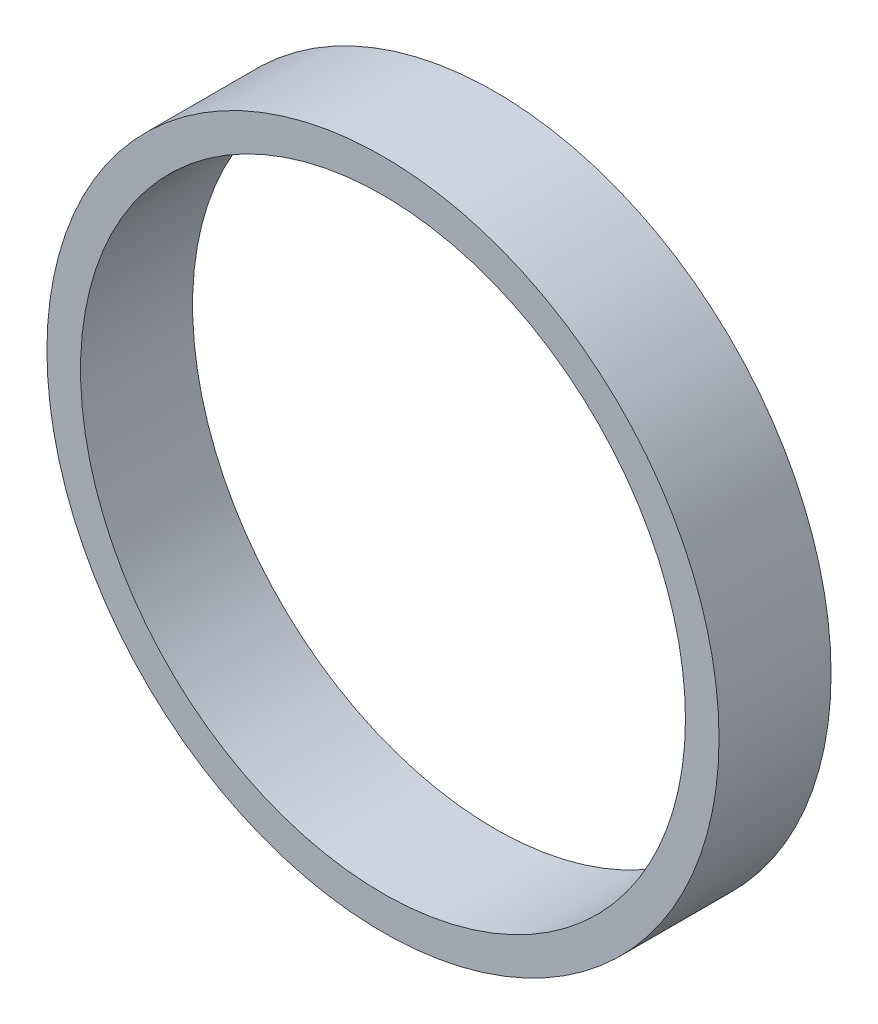
ISO-10303-21;
HEADER;
FILE_DESCRIPTION(('STEP AP214'),'2;1');
FILE_NAME('part.step','',(''),(''),'','','');
FILE_SCHEMA(('AUTOMOTIVE_DESIGN { 1 0 10303 214 1 1 1 1 }'));
ENDSEC;
DATA;
#1=APPLICATION_CONTEXT('core data for automotive mechanical design processes');
#2=APPLICATION_PROTOCOL_DEFINITION('international standard','automotive_design',2000,#1);
#3=PRODUCT_CONTEXT('',#1,'mechanical');
#4=PRODUCT('Part','Part','',(#3));
#5=PRODUCT_RELATED_PRODUCT_CATEGORY('part','',(#4));
#6=PRODUCT_DEFINITION_FORMATION('','',#4);
#7=PRODUCT_DEFINITION_CONTEXT('part definition',#1,'design');
#8=PRODUCT_DEFINITION('design','',#6,#7);
#9=PRODUCT_DEFINITION_SHAPE('','',#8);
#10=(LENGTH_UNIT() NAMED_UNIT(*) SI_UNIT(.MILLI.,.METRE.));
#11=(NAMED_UNIT(*) PLANE_ANGLE_UNIT() SI_UNIT($,.RADIAN.));
#12=(NAMED_UNIT(*) SI_UNIT($,.STERADIAN.) SOLID_ANGLE_UNIT());
#13=UNCERTAINTY_MEASURE_WITH_UNIT(LENGTH_MEASURE(1.E-05),#10,'distance_accuracy_value','');
#14=(GEOMETRIC_REPRESENTATION_CONTEXT(3) GLOBAL_UNCERTAINTY_ASSIGNED_CONTEXT((#13)) GLOBAL_UNIT_ASSIGNED_CONTEXT((#10,
#11,#12)) REPRESENTATION_CONTEXT('',''));
#15=CARTESIAN_POINT('',(0.,0.,0.));
#16=DIRECTION('',(0.,0.,1.));
#17=DIRECTION('',(1.,0.,0.));
#18=AXIS2_PLACEMENT_3D('',#15,#16,#17);
#19=CARTESIAN_POINT('',(0.,0.,20.));
#20=DIRECTION('',(0.,0.,1.));
#21=DIRECTION('',(1.,0.,0.));
#22=AXIS2_PLACEMENT_3D('',#19,#20,#21);
#23=PLANE('',#22);
#24=CARTESIAN_POINT('',(0.,0.,20.));
#25=DIRECTION('',(0.,0.,1.));
#26=DIRECTION('',(1.,0.,0.));
#27=AXIS2_PLACEMENT_3D('',#24,#25,#26);
#28=CIRCLE('',#27,60.);
#29=CARTESIAN_POINT('',(60.,0.,20.));
#30=VERTEX_POINT('',#29);
#31=EDGE_CURVE('E10',#30,#30,#28,.T.);
#32=ORIENTED_EDGE('',*,*,#31,.T.);
#33=EDGE_LOOP('',(#32));
#34=FACE_BOUND('',#33,.T.);
#35=CARTESIAN_POINT('',(0.,0.,20.));
#36=DIRECTION('',(0.,0.,1.));
#37=DIRECTION('',(1.,0.,0.));
#38=AXIS2_PLACEMENT_3D('',#35,#36,#37);
#39=CIRCLE('',#38,54.);
#40=CARTESIAN_POINT('',(54.,0.,20.));
#41=VERTEX_POINT('',#40);
#42=EDGE_CURVE('E48',#41,#41,#39,.T.);
#43=ORIENTED_EDGE('',*,*,#42,.F.);
#44=EDGE_LOOP('',(#43));
#45=FACE_BOUND('',#44,.T.);
#46=ADVANCED_FACE('F40',(#34,#45),#23,.T.);
#47=CARTESIAN_POINT('',(0.,0.,0.));
#48=DIRECTION('',(0.,0.,1.));
#49=DIRECTION('',(1.,0.,0.));
#50=AXIS2_PLACEMENT_3D('',#47,#48,#49);
#51=PLANE('',#50);
#52=CARTESIAN_POINT('',(0.,0.,0.));
#53=DIRECTION('',(0.,0.,1.));
#54=DIRECTION('',(1.,0.,0.));
#55=AXIS2_PLACEMENT_3D('',#52,#53,#54);
#56=CIRCLE('',#55,60.);
#57=CARTESIAN_POINT('',(60.,0.,0.));
#58=VERTEX_POINT('',#57);
#59=EDGE_CURVE('E41',#58,#58,#56,.T.);
#60=ORIENTED_EDGE('',*,*,#59,.F.);
#61=EDGE_LOOP('',(#60));
#62=FACE_BOUND('',#61,.T.);
#63=CARTESIAN_POINT('',(0.,0.,0.));
#64=DIRECTION('',(0.,0.,1.));
#65=DIRECTION('',(1.,0.,0.));
#66=AXIS2_PLACEMENT_3D('',#63,#64,#65);
#67=CIRCLE('',#66,54.);
#68=CARTESIAN_POINT('',(54.,0.,0.));
#69=VERTEX_POINT('',#68);
#70=EDGE_CURVE('E49',#69,#69,#67,.T.);
#71=ORIENTED_EDGE('',*,*,#70,.T.);
#72=EDGE_LOOP('',(#71));
#73=FACE_BOUND('',#72,.T.);
#74=ADVANCED_FACE('F58',(#62,#73),#51,.F.);
#75=CARTESIAN_POINT('',(0.,0.,20.));
#76=DIRECTION('',(0.,0.,-1.));
#77=DIRECTION('',(-1.,0.,0.));
#78=AXIS2_PLACEMENT_3D('',#75,#76,#77);
#79=CYLINDRICAL_SURFACE('',#78,60.);
#80=ORIENTED_EDGE('',*,*,#31,.F.);
#81=EDGE_LOOP('',(#80));
#82=FACE_BOUND('',#81,.T.);
#83=ORIENTED_EDGE('',*,*,#59,.T.);
#84=EDGE_LOOP('',(#83));
#85=FACE_BOUND('',#84,.T.);
#86=ADVANCED_FACE('F39',(#82,#85),#79,.T.);
#87=CARTESIAN_POINT('',(0.,0.,20.));
#88=DIRECTION('',(0.,0.,-1.));
#89=DIRECTION('',(-1.,0.,0.));
#90=AXIS2_PLACEMENT_3D('',#87,#88,#89);
#91=CYLINDRICAL_SURFACE('',#90,54.);
#92=ORIENTED_EDGE('',*,*,#42,.T.);
#93=EDGE_LOOP('',(#92));
#94=FACE_BOUND('',#93,.T.);
#95=ORIENTED_EDGE('',*,*,#70,.F.);
#96=EDGE_LOOP('',(#95));
#97=FACE_BOUND('',#96,.T.);
#98=ADVANCED_FACE('F57',(#94,#97),#91,.F.);
#99=CLOSED_SHELL('',(#46,#74,#86,#98));
#100=MANIFOLD_SOLID_BREP('B2',#99);
#101=ADVANCED_BREP_SHAPE_REPRESENTATION('',(#18,#100),#14);
#102=SHAPE_DEFINITION_REPRESENTATION(#9,#101);
ENDSEC;
END-ISO-10303-21;
